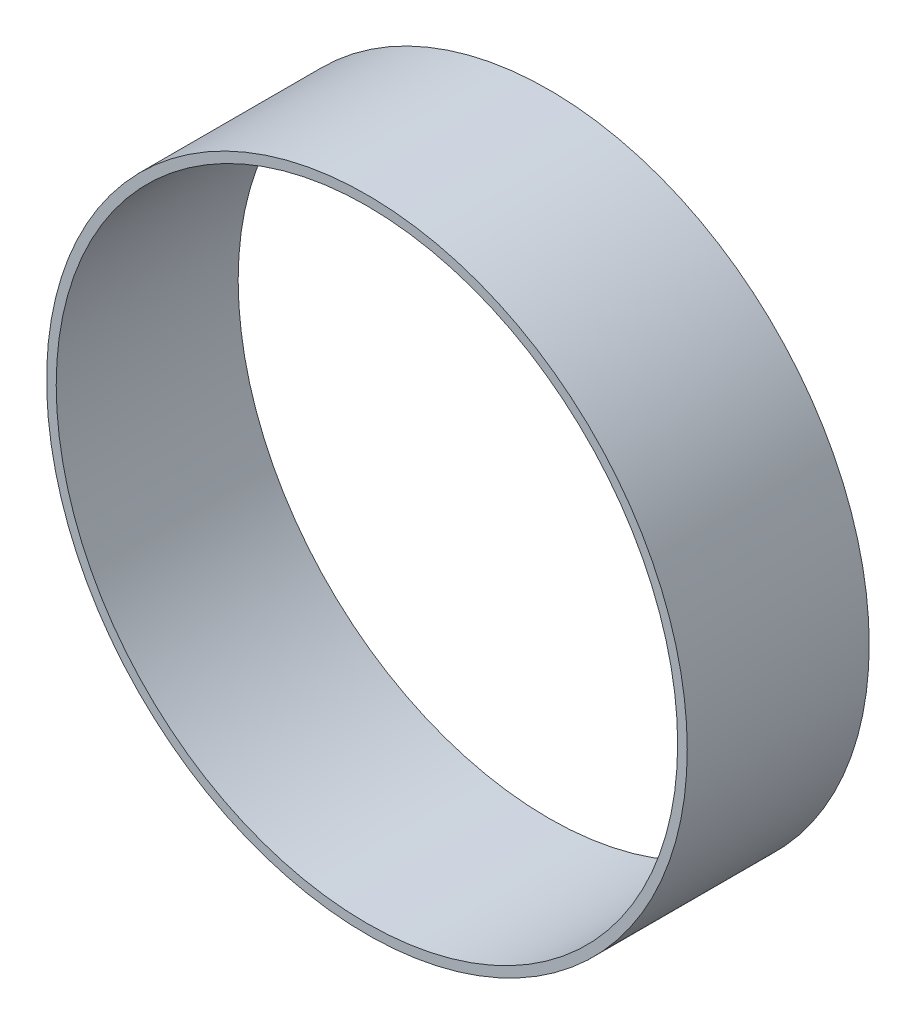
ISO-10303-21;
HEADER;
FILE_DESCRIPTION(('STEP AP214'),'2;1');
FILE_NAME('part.step','',(''),(''),'','','');
FILE_SCHEMA(('AUTOMOTIVE_DESIGN { 1 0 10303 214 1 1 1 1 }'));
ENDSEC;
DATA;
#1=APPLICATION_CONTEXT('core data for automotive mechanical design processes');
#2=APPLICATION_PROTOCOL_DEFINITION('international standard','automotive_design',2000,#1);
#3=PRODUCT_CONTEXT('',#1,'mechanical');
#4=PRODUCT('Part','Part','',(#3));
#5=PRODUCT_RELATED_PRODUCT_CATEGORY('part','',(#4));
#6=PRODUCT_DEFINITION_FORMATION('','',#4);
#7=PRODUCT_DEFINITION_CONTEXT('part definition',#1,'design');
#8=PRODUCT_DEFINITION('design','',#6,#7);
#9=PRODUCT_DEFINITION_SHAPE('','',#8);
#10=(LENGTH_UNIT() NAMED_UNIT(*) SI_UNIT(.MILLI.,.METRE.));
#11=(NAMED_UNIT(*) PLANE_ANGLE_UNIT() SI_UNIT($,.RADIAN.));
#12=(NAMED_UNIT(*) SI_UNIT($,.STERADIAN.) SOLID_ANGLE_UNIT());
#13=UNCERTAINTY_MEASURE_WITH_UNIT(LENGTH_MEASURE(1.E-05),#10,'distance_accuracy_value','');
#14=(GEOMETRIC_REPRESENTATION_CONTEXT(3) GLOBAL_UNCERTAINTY_ASSIGNED_CONTEXT((#13)) GLOBAL_UNIT_ASSIGNED_CONTEXT((#10,
#11,#12)) REPRESENTATION_CONTEXT('',''));
#15=CARTESIAN_POINT('',(0.,0.,0.));
#16=DIRECTION('',(0.,0.,1.));
#17=DIRECTION('',(1.,0.,0.));
#18=AXIS2_PLACEMENT_3D('',#15,#16,#17);
#19=CARTESIAN_POINT('',(0.,0.,28.4));
#20=DIRECTION('',(0.,0.,1.));
#21=DIRECTION('',(1.,0.,0.));
#22=AXIS2_PLACEMENT_3D('',#19,#20,#21);
#23=PLANE('',#22);
#24=CARTESIAN_POINT('',(0.,0.,28.4));
#25=DIRECTION('',(0.,0.,1.));
#26=DIRECTION('',(1.,0.,0.));
#27=AXIS2_PLACEMENT_3D('',#24,#25,#26);
#28=CIRCLE('',#27,50.);
#29=CARTESIAN_POINT('',(50.,0.,28.4));
#30=VERTEX_POINT('',#29);
#31=EDGE_CURVE('E10',#30,#30,#28,.T.);
#32=ORIENTED_EDGE('',*,*,#31,.T.);
#33=EDGE_LOOP('',(#32));
#34=FACE_BOUND('',#33,.T.);
#35=CARTESIAN_POINT('',(0.,0.,28.4));
#36=DIRECTION('',(0.,0.,1.));
#37=DIRECTION('',(1.,0.,0.));
#38=AXIS2_PLACEMENT_3D('',#35,#36,#37);
#39=CIRCLE('',#38,48.5);
#40=CARTESIAN_POINT('',(48.5,0.,28.4));
#41=VERTEX_POINT('',#40);
#42=EDGE_CURVE('E50',#41,#41,#39,.T.);
#43=ORIENTED_EDGE('',*,*,#42,.F.);
#44=EDGE_LOOP('',(#43));
#45=FACE_BOUND('',#44,.T.);
#46=ADVANCED_FACE('F37',(#34,#45),#23,.T.);
#47=CARTESIAN_POINT('',(0.,0.,0.));
#48=DIRECTION('',(0.,0.,1.));
#49=DIRECTION('',(1.,0.,0.));
#50=AXIS2_PLACEMENT_3D('',#47,#48,#49);
#51=PLANE('',#50);
#52=CARTESIAN_POINT('',(0.,0.,0.));
#53=DIRECTION('',(0.,0.,1.));
#54=DIRECTION('',(1.,0.,0.));
#55=AXIS2_PLACEMENT_3D('',#52,#53,#54);
#56=CIRCLE('',#55,50.);
#57=CARTESIAN_POINT('',(50.,0.,0.));
#58=VERTEX_POINT('',#57);
#59=EDGE_CURVE('E41',#58,#58,#56,.T.);
#60=ORIENTED_EDGE('',*,*,#59,.F.);
#61=EDGE_LOOP('',(#60));
#62=FACE_BOUND('',#61,.T.);
#63=CARTESIAN_POINT('',(0.,0.,0.));
#64=DIRECTION('',(0.,0.,1.));
#65=DIRECTION('',(1.,0.,0.));
#66=AXIS2_PLACEMENT_3D('',#63,#64,#65);
#67=CIRCLE('',#66,48.5);
#68=CARTESIAN_POINT('',(48.5,0.,0.));
#69=VERTEX_POINT('',#68);
#70=EDGE_CURVE('E52',#69,#69,#67,.T.);
#71=ORIENTED_EDGE('',*,*,#70,.T.);
#72=EDGE_LOOP('',(#71));
#73=FACE_BOUND('',#72,.T.);
#74=ADVANCED_FACE('F64',(#62,#73),#51,.F.);
#75=CARTESIAN_POINT('',(0.,0.,28.4));
#76=DIRECTION('',(0.,0.,-1.));
#77=DIRECTION('',(-1.,0.,0.));
#78=AXIS2_PLACEMENT_3D('',#75,#76,#77);
#79=CYLINDRICAL_SURFACE('',#78,50.);
#80=ORIENTED_EDGE('',*,*,#31,.F.);
#81=EDGE_LOOP('',(#80));
#82=FACE_BOUND('',#81,.T.);
#83=ORIENTED_EDGE('',*,*,#59,.T.);
#84=EDGE_LOOP('',(#83));
#85=FACE_BOUND('',#84,.T.);
#86=ADVANCED_FACE('F39',(#82,#85),#79,.T.);
#87=CARTESIAN_POINT('',(0.,0.,28.4));
#88=DIRECTION('',(0.,0.,-1.));
#89=DIRECTION('',(-1.,0.,0.));
#90=AXIS2_PLACEMENT_3D('',#87,#88,#89);
#91=CYLINDRICAL_SURFACE('',#90,48.5);
#92=ORIENTED_EDGE('',*,*,#42,.T.);
#93=EDGE_LOOP('',(#92));
#94=FACE_BOUND('',#93,.T.);
#95=ORIENTED_EDGE('',*,*,#70,.F.);
#96=EDGE_LOOP('',(#95));
#97=FACE_BOUND('',#96,.T.);
#98=ADVANCED_FACE('F60',(#94,#97),#91,.F.);
#99=CLOSED_SHELL('',(#46,#74,#86,#98));
#100=MANIFOLD_SOLID_BREP('B2',#99);
#101=ADVANCED_BREP_SHAPE_REPRESENTATION('',(#18,#100),#14);
#102=SHAPE_DEFINITION_REPRESENTATION(#9,#101);
ENDSEC;
END-ISO-10303-21;
